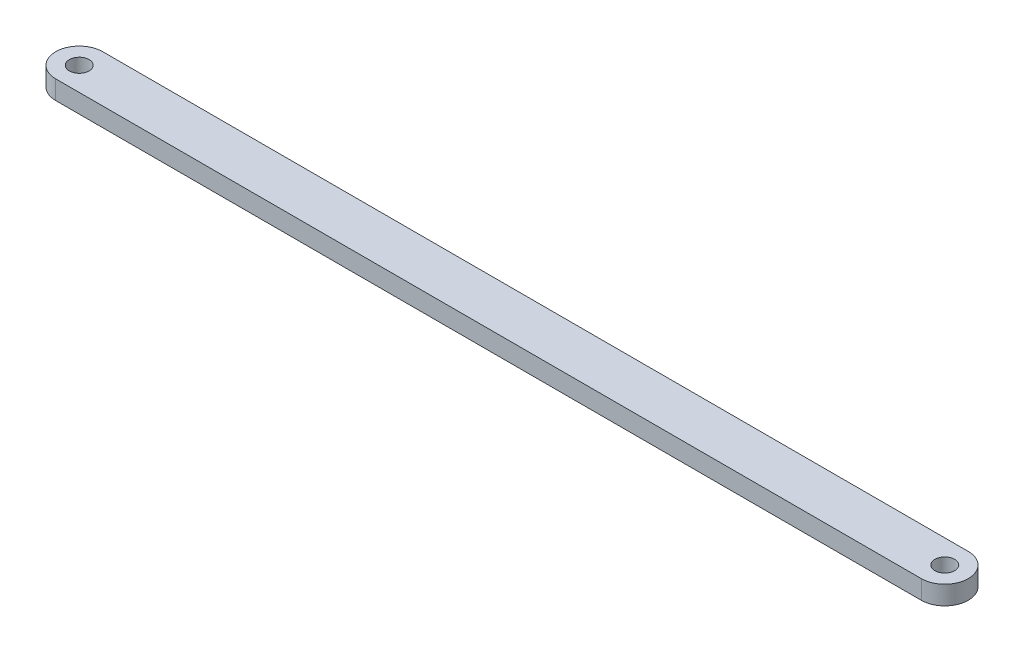
ISO-10303-21;
HEADER;
FILE_DESCRIPTION(('STEP AP214'),'2;1');
FILE_NAME('part.step','',(''),(''),'','','');
FILE_SCHEMA(('AUTOMOTIVE_DESIGN { 1 0 10303 214 1 1 1 1 }'));
ENDSEC;
DATA;
#1=APPLICATION_CONTEXT('core data for automotive mechanical design processes');
#2=APPLICATION_PROTOCOL_DEFINITION('international standard','automotive_design',2000,#1);
#3=PRODUCT_CONTEXT('',#1,'mechanical');
#4=PRODUCT('Part','Part','',(#3));
#5=PRODUCT_RELATED_PRODUCT_CATEGORY('part','',(#4));
#6=PRODUCT_DEFINITION_FORMATION('','',#4);
#7=PRODUCT_DEFINITION_CONTEXT('part definition',#1,'design');
#8=PRODUCT_DEFINITION('design','',#6,#7);
#9=PRODUCT_DEFINITION_SHAPE('','',#8);
#10=(LENGTH_UNIT() NAMED_UNIT(*) SI_UNIT(.MILLI.,.METRE.));
#11=(NAMED_UNIT(*) PLANE_ANGLE_UNIT() SI_UNIT($,.RADIAN.));
#12=(NAMED_UNIT(*) SI_UNIT($,.STERADIAN.) SOLID_ANGLE_UNIT());
#13=UNCERTAINTY_MEASURE_WITH_UNIT(LENGTH_MEASURE(1.E-05),#10,'distance_accuracy_value','');
#14=(GEOMETRIC_REPRESENTATION_CONTEXT(3) GLOBAL_UNCERTAINTY_ASSIGNED_CONTEXT((#13)) GLOBAL_UNIT_ASSIGNED_CONTEXT((#10,
#11,#12)) REPRESENTATION_CONTEXT('',''));
#15=CARTESIAN_POINT('',(0.,0.,0.));
#16=DIRECTION('',(0.,0.,1.));
#17=DIRECTION('',(1.,0.,0.));
#18=AXIS2_PLACEMENT_3D('',#15,#16,#17);
#19=CARTESIAN_POINT('',(0.,2.,0.));
#20=DIRECTION('',(0.,1.,0.));
#21=DIRECTION('',(0.,0.,1.));
#22=AXIS2_PLACEMENT_3D('',#19,#20,#21);
#23=PLANE('',#22);
#24=CARTESIAN_POINT('',(0.,2.,0.));
#25=DIRECTION('',(0.,1.,0.));
#26=DIRECTION('',(0.,0.,1.));
#27=AXIS2_PLACEMENT_3D('',#24,#25,#26);
#28=CIRCLE('',#27,1.05);
#29=CARTESIAN_POINT('',(0.,2.,1.05));
#30=VERTEX_POINT('',#29);
#31=EDGE_CURVE('E104',#30,#30,#28,.T.);
#32=ORIENTED_EDGE('',*,*,#31,.F.);
#33=EDGE_LOOP('',(#32));
#34=FACE_BOUND('',#33,.T.);
#35=CARTESIAN_POINT('',(0.,2.,0.));
#36=DIRECTION('',(0.,1.,0.));
#37=DIRECTION('',(0.,0.,1.));
#38=AXIS2_PLACEMENT_3D('',#35,#36,#37);
#39=CIRCLE('',#38,2.5);
#40=CARTESIAN_POINT('',(0.,2.,-2.5));
#41=VERTEX_POINT('',#40);
#42=CARTESIAN_POINT('',(0.,2.,2.5));
#43=VERTEX_POINT('',#42);
#44=EDGE_CURVE('E89',#41,#43,#39,.T.);
#45=ORIENTED_EDGE('',*,*,#44,.T.);
#46=DIRECTION('',(1.,0.,0.));
#47=VECTOR('',#46,1.);
#48=CARTESIAN_POINT('',(0.,2.,2.5));
#49=LINE('',#48,#47);
#50=CARTESIAN_POINT('',(92.,2.,2.5));
#51=VERTEX_POINT('',#50);
#52=EDGE_CURVE('E84',#43,#51,#49,.T.);
#53=ORIENTED_EDGE('',*,*,#52,.T.);
#54=CARTESIAN_POINT('',(92.,2.,0.));
#55=DIRECTION('',(0.,1.,0.));
#56=DIRECTION('',(0.,0.,1.));
#57=AXIS2_PLACEMENT_3D('',#54,#55,#56);
#58=CIRCLE('',#57,2.5);
#59=CARTESIAN_POINT('',(92.,2.,-2.5));
#60=VERTEX_POINT('',#59);
#61=EDGE_CURVE('E87',#51,#60,#58,.T.);
#62=ORIENTED_EDGE('',*,*,#61,.T.);
#63=DIRECTION('',(-1.,0.,0.));
#64=VECTOR('',#63,1.);
#65=CARTESIAN_POINT('',(0.,2.,-2.5));
#66=LINE('',#65,#64);
#67=EDGE_CURVE('E54',#60,#41,#66,.T.);
#68=ORIENTED_EDGE('',*,*,#67,.T.);
#69=EDGE_LOOP('',(#45,#53,#62,#68));
#70=FACE_BOUND('',#69,.T.);
#71=CARTESIAN_POINT('',(92.,2.,0.));
#72=DIRECTION('',(0.,1.,0.));
#73=DIRECTION('',(0.,0.,1.));
#74=AXIS2_PLACEMENT_3D('',#71,#72,#73);
#75=CIRCLE('',#74,1.04999999999999);
#76=CARTESIAN_POINT('',(92.,2.,1.04999999999999));
#77=VERTEX_POINT('',#76);
#78=EDGE_CURVE('E119',#77,#77,#75,.T.);
#79=ORIENTED_EDGE('',*,*,#78,.F.);
#80=EDGE_LOOP('',(#79));
#81=FACE_BOUND('',#80,.T.);
#82=ADVANCED_FACE('F37',(#34,#70,#81),#23,.T.);
#83=CARTESIAN_POINT('',(0.,0.,0.));
#84=DIRECTION('',(0.,1.,0.));
#85=DIRECTION('',(0.,0.,1.));
#86=AXIS2_PLACEMENT_3D('',#83,#84,#85);
#87=PLANE('',#86);
#88=CARTESIAN_POINT('',(0.,0.,0.));
#89=DIRECTION('',(0.,1.,0.));
#90=DIRECTION('',(0.,0.,1.));
#91=AXIS2_PLACEMENT_3D('',#88,#89,#90);
#92=CIRCLE('',#91,2.5);
#93=CARTESIAN_POINT('',(0.,0.,-2.5));
#94=VERTEX_POINT('',#93);
#95=CARTESIAN_POINT('',(0.,0.,2.5));
#96=VERTEX_POINT('',#95);
#97=EDGE_CURVE('E101',#94,#96,#92,.T.);
#98=ORIENTED_EDGE('',*,*,#97,.F.);
#99=DIRECTION('',(-1.,0.,0.));
#100=VECTOR('',#99,1.);
#101=CARTESIAN_POINT('',(0.,0.,-2.5));
#102=LINE('',#101,#100);
#103=CARTESIAN_POINT('',(92.,0.,-2.5));
#104=VERTEX_POINT('',#103);
#105=EDGE_CURVE('E77',#104,#94,#102,.T.);
#106=ORIENTED_EDGE('',*,*,#105,.F.);
#107=CARTESIAN_POINT('',(92.,0.,0.));
#108=DIRECTION('',(0.,1.,0.));
#109=DIRECTION('',(0.,0.,1.));
#110=AXIS2_PLACEMENT_3D('',#107,#108,#109);
#111=CIRCLE('',#110,2.5);
#112=CARTESIAN_POINT('',(92.,0.,2.5));
#113=VERTEX_POINT('',#112);
#114=EDGE_CURVE('E71',#113,#104,#111,.T.);
#115=ORIENTED_EDGE('',*,*,#114,.F.);
#116=DIRECTION('',(1.,0.,0.));
#117=VECTOR('',#116,1.);
#118=CARTESIAN_POINT('',(0.,0.,2.5));
#119=LINE('',#118,#117);
#120=EDGE_CURVE('E93',#96,#113,#119,.T.);
#121=ORIENTED_EDGE('',*,*,#120,.F.);
#122=EDGE_LOOP('',(#98,#106,#115,#121));
#123=FACE_BOUND('',#122,.T.);
#124=CARTESIAN_POINT('',(0.,0.,0.));
#125=DIRECTION('',(0.,1.,0.));
#126=DIRECTION('',(0.,0.,1.));
#127=AXIS2_PLACEMENT_3D('',#124,#125,#126);
#128=CIRCLE('',#127,1.05);
#129=CARTESIAN_POINT('',(0.,0.,1.05));
#130=VERTEX_POINT('',#129);
#131=EDGE_CURVE('E116',#130,#130,#128,.T.);
#132=ORIENTED_EDGE('',*,*,#131,.T.);
#133=EDGE_LOOP('',(#132));
#134=FACE_BOUND('',#133,.T.);
#135=CARTESIAN_POINT('',(92.,0.,0.));
#136=DIRECTION('',(0.,1.,0.));
#137=DIRECTION('',(0.,0.,1.));
#138=AXIS2_PLACEMENT_3D('',#135,#136,#137);
#139=CIRCLE('',#138,1.04999999999999);
#140=CARTESIAN_POINT('',(92.,0.,1.04999999999999));
#141=VERTEX_POINT('',#140);
#142=EDGE_CURVE('E122',#141,#141,#139,.T.);
#143=ORIENTED_EDGE('',*,*,#142,.T.);
#144=EDGE_LOOP('',(#143));
#145=FACE_BOUND('',#144,.T.);
#146=ADVANCED_FACE('F112',(#123,#134,#145),#87,.F.);
#147=CARTESIAN_POINT('',(0.,2.,0.));
#148=DIRECTION('',(0.,-1.,0.));
#149=DIRECTION('',(0.,0.,-1.));
#150=AXIS2_PLACEMENT_3D('',#147,#148,#149);
#151=CYLINDRICAL_SURFACE('',#150,2.5);
#152=ORIENTED_EDGE('',*,*,#97,.T.);
#153=DIRECTION('',(0.,-1.,0.));
#154=VECTOR('',#153,1.);
#155=CARTESIAN_POINT('',(0.,2.,2.5));
#156=LINE('',#155,#154);
#157=EDGE_CURVE('E11',#43,#96,#156,.T.);
#158=ORIENTED_EDGE('',*,*,#157,.F.);
#159=ORIENTED_EDGE('',*,*,#44,.F.);
#160=DIRECTION('',(0.,-1.,0.));
#161=VECTOR('',#160,1.);
#162=CARTESIAN_POINT('',(0.,2.,-2.5));
#163=LINE('',#162,#161);
#164=EDGE_CURVE('E97',#41,#94,#163,.T.);
#165=ORIENTED_EDGE('',*,*,#164,.T.);
#166=EDGE_LOOP('',(#152,#158,#159,#165));
#167=FACE_BOUND('',#166,.T.);
#168=ADVANCED_FACE('F39',(#167),#151,.T.);
#169=CARTESIAN_POINT('',(0.,2.,2.5));
#170=DIRECTION('',(0.,0.,-1.));
#171=DIRECTION('',(-1.,0.,0.));
#172=AXIS2_PLACEMENT_3D('',#169,#170,#171);
#173=PLANE('',#172);
#174=ORIENTED_EDGE('',*,*,#120,.T.);
#175=DIRECTION('',(0.,-1.,0.));
#176=VECTOR('',#175,1.);
#177=CARTESIAN_POINT('',(92.,2.,2.5));
#178=LINE('',#177,#176);
#179=EDGE_CURVE('E46',#51,#113,#178,.T.);
#180=ORIENTED_EDGE('',*,*,#179,.F.);
#181=ORIENTED_EDGE('',*,*,#52,.F.);
#182=ORIENTED_EDGE('',*,*,#157,.T.);
#183=EDGE_LOOP('',(#174,#180,#181,#182));
#184=FACE_BOUND('',#183,.T.);
#185=ADVANCED_FACE('F92',(#184),#173,.F.);
#186=CARTESIAN_POINT('',(92.,2.,0.));
#187=DIRECTION('',(0.,-1.,0.));
#188=DIRECTION('',(0.,0.,-1.));
#189=AXIS2_PLACEMENT_3D('',#186,#187,#188);
#190=CYLINDRICAL_SURFACE('',#189,2.5);
#191=ORIENTED_EDGE('',*,*,#114,.T.);
#192=DIRECTION('',(0.,-1.,0.));
#193=VECTOR('',#192,1.);
#194=CARTESIAN_POINT('',(92.,2.,-2.5));
#195=LINE('',#194,#193);
#196=EDGE_CURVE('E94',#60,#104,#195,.T.);
#197=ORIENTED_EDGE('',*,*,#196,.F.);
#198=ORIENTED_EDGE('',*,*,#61,.F.);
#199=ORIENTED_EDGE('',*,*,#179,.T.);
#200=EDGE_LOOP('',(#191,#197,#198,#199));
#201=FACE_BOUND('',#200,.T.);
#202=ADVANCED_FACE('F95',(#201),#190,.T.);
#203=CARTESIAN_POINT('',(0.,2.,-2.5));
#204=DIRECTION('',(0.,0.,1.));
#205=DIRECTION('',(1.,0.,0.));
#206=AXIS2_PLACEMENT_3D('',#203,#204,#205);
#207=PLANE('',#206);
#208=ORIENTED_EDGE('',*,*,#105,.T.);
#209=ORIENTED_EDGE('',*,*,#164,.F.);
#210=ORIENTED_EDGE('',*,*,#67,.F.);
#211=ORIENTED_EDGE('',*,*,#196,.T.);
#212=EDGE_LOOP('',(#208,#209,#210,#211));
#213=FACE_BOUND('',#212,.T.);
#214=ADVANCED_FACE('F109',(#213),#207,.F.);
#215=CARTESIAN_POINT('',(0.,2.,0.));
#216=DIRECTION('',(0.,-1.,0.));
#217=DIRECTION('',(0.,0.,-1.));
#218=AXIS2_PLACEMENT_3D('',#215,#216,#217);
#219=CYLINDRICAL_SURFACE('',#218,1.05);
#220=ORIENTED_EDGE('',*,*,#31,.T.);
#221=EDGE_LOOP('',(#220));
#222=FACE_BOUND('',#221,.T.);
#223=ORIENTED_EDGE('',*,*,#131,.F.);
#224=EDGE_LOOP('',(#223));
#225=FACE_BOUND('',#224,.T.);
#226=ADVANCED_FACE('F139',(#222,#225),#219,.F.);
#227=CARTESIAN_POINT('',(92.,2.,0.));
#228=DIRECTION('',(0.,-1.,0.));
#229=DIRECTION('',(0.,0.,-1.));
#230=AXIS2_PLACEMENT_3D('',#227,#228,#229);
#231=CYLINDRICAL_SURFACE('',#230,1.04999999999999);
#232=ORIENTED_EDGE('',*,*,#78,.T.);
#233=EDGE_LOOP('',(#232));
#234=FACE_BOUND('',#233,.T.);
#235=ORIENTED_EDGE('',*,*,#142,.F.);
#236=EDGE_LOOP('',(#235));
#237=FACE_BOUND('',#236,.T.);
#238=ADVANCED_FACE('F128',(#234,#237),#231,.F.);
#239=CLOSED_SHELL('',(#82,#146,#168,#185,#202,#214,#226,#238));
#240=MANIFOLD_SOLID_BREP('B2',#239);
#241=ADVANCED_BREP_SHAPE_REPRESENTATION('',(#18,#240),#14);
#242=SHAPE_DEFINITION_REPRESENTATION(#9,#241);
ENDSEC;
END-ISO-10303-21;
